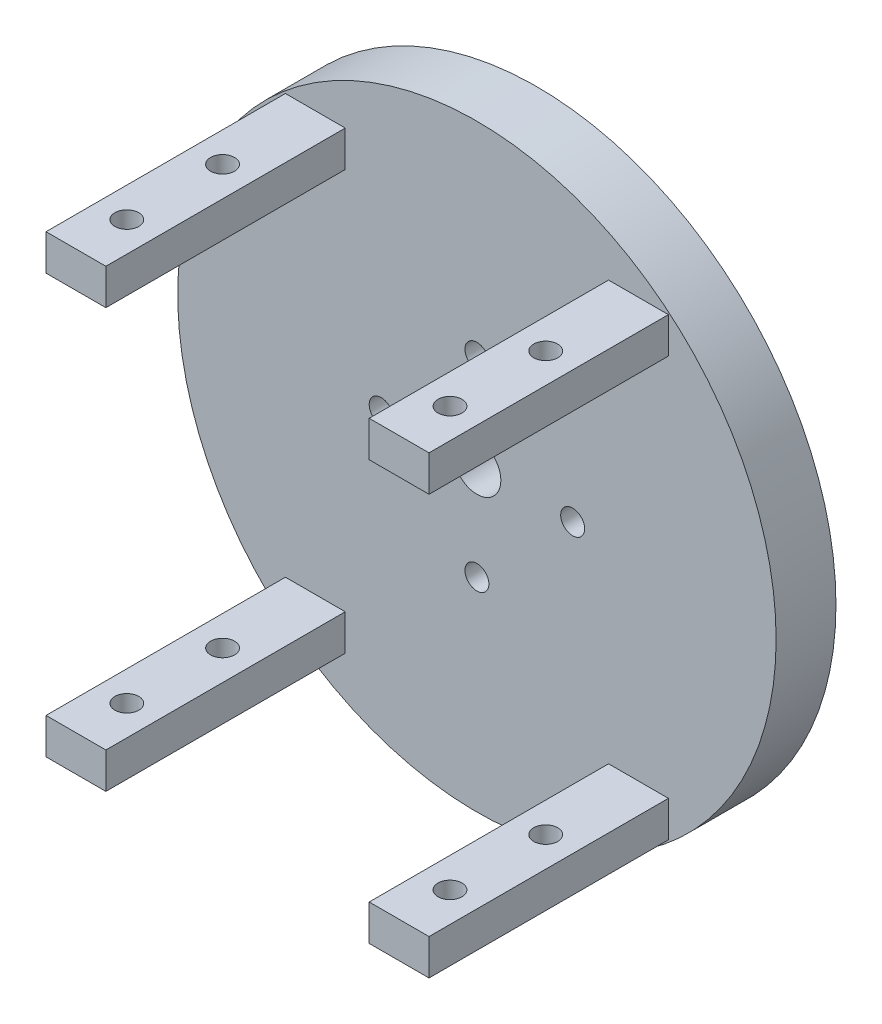
ISO-10303-21;
HEADER;
FILE_DESCRIPTION(('STEP AP214'),'2;1');
FILE_NAME('part.step','',(''),(''),'','','');
FILE_SCHEMA(('AUTOMOTIVE_DESIGN { 1 0 10303 214 1 1 1 1 }'));
ENDSEC;
DATA;
#1=APPLICATION_CONTEXT('core data for automotive mechanical design processes');
#2=APPLICATION_PROTOCOL_DEFINITION('international standard','automotive_design',2000,#1);
#3=PRODUCT_CONTEXT('',#1,'mechanical');
#4=PRODUCT('Part','Part','',(#3));
#5=PRODUCT_RELATED_PRODUCT_CATEGORY('part','',(#4));
#6=PRODUCT_DEFINITION_FORMATION('','',#4);
#7=PRODUCT_DEFINITION_CONTEXT('part definition',#1,'design');
#8=PRODUCT_DEFINITION('design','',#6,#7);
#9=PRODUCT_DEFINITION_SHAPE('','',#8);
#10=(LENGTH_UNIT() NAMED_UNIT(*) SI_UNIT(.MILLI.,.METRE.));
#11=(NAMED_UNIT(*) PLANE_ANGLE_UNIT() SI_UNIT($,.RADIAN.));
#12=(NAMED_UNIT(*) SI_UNIT($,.STERADIAN.) SOLID_ANGLE_UNIT());
#13=UNCERTAINTY_MEASURE_WITH_UNIT(LENGTH_MEASURE(1.E-05),#10,'distance_accuracy_value','');
#14=(GEOMETRIC_REPRESENTATION_CONTEXT(3) GLOBAL_UNCERTAINTY_ASSIGNED_CONTEXT((#13)) GLOBAL_UNIT_ASSIGNED_CONTEXT((#10,
#11,#12)) REPRESENTATION_CONTEXT('',''));
#15=CARTESIAN_POINT('',(0.,0.,0.));
#16=DIRECTION('',(0.,0.,1.));
#17=DIRECTION('',(1.,0.,0.));
#18=AXIS2_PLACEMENT_3D('',#15,#16,#17);
#19=CARTESIAN_POINT('',(2.25414240564596E-13,0.,5.));
#20=DIRECTION('',(0.,0.,1.));
#21=DIRECTION('',(1.,0.,0.));
#22=AXIS2_PLACEMENT_3D('',#19,#20,#21);
#23=PLANE('',#22);
#24=CARTESIAN_POINT('',(4.51808198568511E-13,-8.,5.));
#25=DIRECTION('',(0.,0.,1.));
#26=DIRECTION('',(1.,0.,0.));
#27=AXIS2_PLACEMENT_3D('',#24,#25,#26);
#28=CIRCLE('',#27,1.00000000000049);
#29=CARTESIAN_POINT('',(1.00000000000094,-8.,5.));
#30=VERTEX_POINT('',#29);
#31=EDGE_CURVE('E329',#30,#30,#28,.T.);
#32=ORIENTED_EDGE('',*,*,#31,.F.);
#33=EDGE_LOOP('',(#32));
#34=FACE_BOUND('',#33,.T.);
#35=CARTESIAN_POINT('',(0.,8.,5.));
#36=DIRECTION('',(0.,0.,1.));
#37=DIRECTION('',(1.,0.,0.));
#38=AXIS2_PLACEMENT_3D('',#35,#36,#37);
#39=CIRCLE('',#38,1.);
#40=CARTESIAN_POINT('',(1.,8.,5.));
#41=VERTEX_POINT('',#40);
#42=EDGE_CURVE('E345',#41,#41,#39,.T.);
#43=ORIENTED_EDGE('',*,*,#42,.F.);
#44=EDGE_LOOP('',(#43));
#45=FACE_BOUND('',#44,.T.);
#46=CARTESIAN_POINT('',(2.25414240564596E-13,0.,5.));
#47=DIRECTION('',(0.,0.,1.));
#48=DIRECTION('',(1.,0.,0.));
#49=AXIS2_PLACEMENT_3D('',#46,#47,#48);
#50=CIRCLE('',#49,25.);
#51=CARTESIAN_POINT('',(25.0000000000002,0.,5.));
#52=VERTEX_POINT('',#51);
#53=EDGE_CURVE('E11',#52,#52,#50,.T.);
#54=ORIENTED_EDGE('',*,*,#53,.T.);
#55=EDGE_LOOP('',(#54));
#56=FACE_BOUND('',#55,.T.);
#57=CARTESIAN_POINT('',(2.25414240564596E-13,0.,5.));
#58=DIRECTION('',(0.,0.,1.));
#59=DIRECTION('',(1.,0.,0.));
#60=AXIS2_PLACEMENT_3D('',#57,#58,#59);
#61=CIRCLE('',#60,2.);
#62=CARTESIAN_POINT('',(2.00000000000023,0.,5.));
#63=VERTEX_POINT('',#62);
#64=EDGE_CURVE('E353',#63,#63,#61,.T.);
#65=ORIENTED_EDGE('',*,*,#64,.F.);
#66=EDGE_LOOP('',(#65));
#67=FACE_BOUND('',#66,.T.);
#68=CARTESIAN_POINT('',(8.,0.,5.));
#69=DIRECTION('',(0.,0.,1.));
#70=DIRECTION('',(1.,0.,0.));
#71=AXIS2_PLACEMENT_3D('',#68,#69,#70);
#72=CIRCLE('',#71,1.);
#73=CARTESIAN_POINT('',(9.,0.,5.));
#74=VERTEX_POINT('',#73);
#75=EDGE_CURVE('E337',#74,#74,#72,.T.);
#76=ORIENTED_EDGE('',*,*,#75,.F.);
#77=EDGE_LOOP('',(#76));
#78=FACE_BOUND('',#77,.T.);
#79=CARTESIAN_POINT('',(-8.,0.,5.));
#80=DIRECTION('',(0.,0.,1.));
#81=DIRECTION('',(1.,0.,0.));
#82=AXIS2_PLACEMENT_3D('',#79,#80,#81);
#83=CIRCLE('',#82,1.);
#84=CARTESIAN_POINT('',(-7.,0.,5.));
#85=VERTEX_POINT('',#84);
#86=EDGE_CURVE('E321',#85,#85,#83,.T.);
#87=ORIENTED_EDGE('',*,*,#86,.F.);
#88=EDGE_LOOP('',(#87));
#89=FACE_BOUND('',#88,.T.);
#90=DIRECTION('',(1.,0.,0.));
#91=VECTOR('',#90,1.);
#92=CARTESIAN_POINT('',(11.0000000000002,-19.,5.));
#93=LINE('',#92,#91);
#94=CARTESIAN_POINT('',(11.0000000000002,-19.,5.));
#95=VERTEX_POINT('',#94);
#96=CARTESIAN_POINT('',(16.0000000000002,-19.,5.));
#97=VERTEX_POINT('',#96);
#98=EDGE_CURVE('E298',#95,#97,#93,.T.);
#99=ORIENTED_EDGE('',*,*,#98,.F.);
#100=DIRECTION('',(0.,-1.,0.));
#101=VECTOR('',#100,1.);
#102=CARTESIAN_POINT('',(11.0000000000002,-16.,5.));
#103=LINE('',#102,#101);
#104=CARTESIAN_POINT('',(11.0000000000002,-16.,5.));
#105=VERTEX_POINT('',#104);
#106=EDGE_CURVE('E268',#105,#95,#103,.T.);
#107=ORIENTED_EDGE('',*,*,#106,.F.);
#108=DIRECTION('',(-1.,0.,0.));
#109=VECTOR('',#108,1.);
#110=CARTESIAN_POINT('',(11.0000000000002,-16.,5.));
#111=LINE('',#110,#109);
#112=CARTESIAN_POINT('',(16.0000000000002,-16.,5.));
#113=VERTEX_POINT('',#112);
#114=EDGE_CURVE('E285',#113,#105,#111,.T.);
#115=ORIENTED_EDGE('',*,*,#114,.F.);
#116=DIRECTION('',(0.,1.,0.));
#117=VECTOR('',#116,1.);
#118=CARTESIAN_POINT('',(16.0000000000002,-19.,5.));
#119=LINE('',#118,#117);
#120=EDGE_CURVE('E301',#97,#113,#119,.T.);
#121=ORIENTED_EDGE('',*,*,#120,.F.);
#122=EDGE_LOOP('',(#99,#107,#115,#121));
#123=FACE_BOUND('',#122,.T.);
#124=DIRECTION('',(-1.,0.,0.));
#125=VECTOR('',#124,1.);
#126=CARTESIAN_POINT('',(-10.9999999999998,19.,5.));
#127=LINE('',#126,#125);
#128=CARTESIAN_POINT('',(-10.9999999999998,19.,5.));
#129=VERTEX_POINT('',#128);
#130=CARTESIAN_POINT('',(-15.9999999999998,19.,5.));
#131=VERTEX_POINT('',#130);
#132=EDGE_CURVE('E261',#129,#131,#127,.T.);
#133=ORIENTED_EDGE('',*,*,#132,.F.);
#134=DIRECTION('',(0.,1.,0.));
#135=VECTOR('',#134,1.);
#136=CARTESIAN_POINT('',(-10.9999999999998,19.,5.));
#137=LINE('',#136,#135);
#138=CARTESIAN_POINT('',(-10.9999999999998,16.,5.));
#139=VERTEX_POINT('',#138);
#140=EDGE_CURVE('E264',#139,#129,#137,.T.);
#141=ORIENTED_EDGE('',*,*,#140,.F.);
#142=DIRECTION('',(1.,0.,0.));
#143=VECTOR('',#142,1.);
#144=CARTESIAN_POINT('',(-15.9999999999998,16.,5.));
#145=LINE('',#144,#143);
#146=CARTESIAN_POINT('',(-15.9999999999998,16.,5.));
#147=VERTEX_POINT('',#146);
#148=EDGE_CURVE('E253',#147,#139,#145,.T.);
#149=ORIENTED_EDGE('',*,*,#148,.F.);
#150=DIRECTION('',(0.,-1.,0.));
#151=VECTOR('',#150,1.);
#152=CARTESIAN_POINT('',(-15.9999999999998,19.,5.));
#153=LINE('',#152,#151);
#154=EDGE_CURVE('E256',#131,#147,#153,.T.);
#155=ORIENTED_EDGE('',*,*,#154,.F.);
#156=EDGE_LOOP('',(#133,#141,#149,#155));
#157=FACE_BOUND('',#156,.T.);
#158=DIRECTION('',(-1.,0.,0.));
#159=VECTOR('',#158,1.);
#160=CARTESIAN_POINT('',(-15.9999999999998,-16.,5.));
#161=LINE('',#160,#159);
#162=CARTESIAN_POINT('',(-10.9999999999998,-16.,5.));
#163=VERTEX_POINT('',#162);
#164=CARTESIAN_POINT('',(-15.9999999999998,-16.,5.));
#165=VERTEX_POINT('',#164);
#166=EDGE_CURVE('E220',#163,#165,#161,.T.);
#167=ORIENTED_EDGE('',*,*,#166,.F.);
#168=DIRECTION('',(0.,1.,0.));
#169=VECTOR('',#168,1.);
#170=CARTESIAN_POINT('',(-10.9999999999998,-16.,5.));
#171=LINE('',#170,#169);
#172=CARTESIAN_POINT('',(-10.9999999999998,-19.,5.));
#173=VERTEX_POINT('',#172);
#174=EDGE_CURVE('E223',#173,#163,#171,.T.);
#175=ORIENTED_EDGE('',*,*,#174,.F.);
#176=DIRECTION('',(1.,0.,0.));
#177=VECTOR('',#176,1.);
#178=CARTESIAN_POINT('',(-15.9999999999998,-19.,5.));
#179=LINE('',#178,#177);
#180=CARTESIAN_POINT('',(-15.9999999999998,-19.,5.));
#181=VERTEX_POINT('',#180);
#182=EDGE_CURVE('E213',#181,#173,#179,.T.);
#183=ORIENTED_EDGE('',*,*,#182,.F.);
#184=DIRECTION('',(0.,-1.,0.));
#185=VECTOR('',#184,1.);
#186=CARTESIAN_POINT('',(-15.9999999999998,-16.,5.));
#187=LINE('',#186,#185);
#188=EDGE_CURVE('E216',#165,#181,#187,.T.);
#189=ORIENTED_EDGE('',*,*,#188,.F.);
#190=EDGE_LOOP('',(#167,#175,#183,#189));
#191=FACE_BOUND('',#190,.T.);
#192=DIRECTION('',(0.,-1.,0.));
#193=VECTOR('',#192,1.);
#194=CARTESIAN_POINT('',(11.0000000000002,19.,5.));
#195=LINE('',#194,#193);
#196=CARTESIAN_POINT('',(11.0000000000002,19.,5.));
#197=VERTEX_POINT('',#196);
#198=CARTESIAN_POINT('',(11.0000000000002,16.,5.));
#199=VERTEX_POINT('',#198);
#200=EDGE_CURVE('E182',#197,#199,#195,.T.);
#201=ORIENTED_EDGE('',*,*,#200,.F.);
#202=DIRECTION('',(-1.,0.,0.));
#203=VECTOR('',#202,1.);
#204=CARTESIAN_POINT('',(16.0000000000002,19.,5.));
#205=LINE('',#204,#203);
#206=CARTESIAN_POINT('',(16.0000000000002,19.,5.));
#207=VERTEX_POINT('',#206);
#208=EDGE_CURVE('E176',#207,#197,#205,.T.);
#209=ORIENTED_EDGE('',*,*,#208,.F.);
#210=DIRECTION('',(0.,1.,0.));
#211=VECTOR('',#210,1.);
#212=CARTESIAN_POINT('',(16.0000000000002,16.,5.));
#213=LINE('',#212,#211);
#214=CARTESIAN_POINT('',(16.0000000000002,16.,5.));
#215=VERTEX_POINT('',#214);
#216=EDGE_CURVE('E160',#215,#207,#213,.T.);
#217=ORIENTED_EDGE('',*,*,#216,.F.);
#218=DIRECTION('',(1.,0.,0.));
#219=VECTOR('',#218,1.);
#220=CARTESIAN_POINT('',(11.0000000000002,16.,5.));
#221=LINE('',#220,#219);
#222=EDGE_CURVE('E169',#199,#215,#221,.T.);
#223=ORIENTED_EDGE('',*,*,#222,.F.);
#224=EDGE_LOOP('',(#201,#209,#217,#223));
#225=FACE_BOUND('',#224,.T.);
#226=ADVANCED_FACE('F43',(#34,#45,#56,#67,#78,#89,#123,#157,#191,#225),#23,.T.);
#227=CARTESIAN_POINT('',(2.25414240564596E-13,0.,0.));
#228=DIRECTION('',(0.,0.,1.));
#229=DIRECTION('',(1.,0.,0.));
#230=AXIS2_PLACEMENT_3D('',#227,#228,#229);
#231=PLANE('',#230);
#232=CARTESIAN_POINT('',(2.25414240564596E-13,0.,0.));
#233=DIRECTION('',(0.,0.,1.));
#234=DIRECTION('',(1.,0.,0.));
#235=AXIS2_PLACEMENT_3D('',#232,#233,#234);
#236=CIRCLE('',#235,25.);
#237=CARTESIAN_POINT('',(25.0000000000002,0.,0.));
#238=VERTEX_POINT('',#237);
#239=EDGE_CURVE('E53',#238,#238,#236,.T.);
#240=ORIENTED_EDGE('',*,*,#239,.F.);
#241=EDGE_LOOP('',(#240));
#242=FACE_BOUND('',#241,.T.);
#243=CARTESIAN_POINT('',(2.25414240564596E-13,0.,0.));
#244=DIRECTION('',(0.,0.,1.));
#245=DIRECTION('',(1.,0.,0.));
#246=AXIS2_PLACEMENT_3D('',#243,#244,#245);
#247=CIRCLE('',#246,2.);
#248=CARTESIAN_POINT('',(2.00000000000023,0.,0.));
#249=VERTEX_POINT('',#248);
#250=EDGE_CURVE('E349',#249,#249,#247,.T.);
#251=ORIENTED_EDGE('',*,*,#250,.T.);
#252=EDGE_LOOP('',(#251));
#253=FACE_BOUND('',#252,.T.);
#254=CARTESIAN_POINT('',(0.,8.,0.));
#255=DIRECTION('',(0.,0.,1.));
#256=DIRECTION('',(1.,0.,0.));
#257=AXIS2_PLACEMENT_3D('',#254,#255,#256);
#258=CIRCLE('',#257,1.);
#259=CARTESIAN_POINT('',(1.,8.,0.));
#260=VERTEX_POINT('',#259);
#261=EDGE_CURVE('E341',#260,#260,#258,.T.);
#262=ORIENTED_EDGE('',*,*,#261,.T.);
#263=EDGE_LOOP('',(#262));
#264=FACE_BOUND('',#263,.T.);
#265=CARTESIAN_POINT('',(8.,0.,0.));
#266=DIRECTION('',(0.,0.,1.));
#267=DIRECTION('',(1.,0.,0.));
#268=AXIS2_PLACEMENT_3D('',#265,#266,#267);
#269=CIRCLE('',#268,1.);
#270=CARTESIAN_POINT('',(9.,0.,0.));
#271=VERTEX_POINT('',#270);
#272=EDGE_CURVE('E333',#271,#271,#269,.T.);
#273=ORIENTED_EDGE('',*,*,#272,.T.);
#274=EDGE_LOOP('',(#273));
#275=FACE_BOUND('',#274,.T.);
#276=CARTESIAN_POINT('',(4.51808198568511E-13,-8.,0.));
#277=DIRECTION('',(0.,0.,1.));
#278=DIRECTION('',(1.,0.,0.));
#279=AXIS2_PLACEMENT_3D('',#276,#277,#278);
#280=CIRCLE('',#279,1.00000000000049);
#281=CARTESIAN_POINT('',(1.00000000000094,-8.,0.));
#282=VERTEX_POINT('',#281);
#283=EDGE_CURVE('E325',#282,#282,#280,.T.);
#284=ORIENTED_EDGE('',*,*,#283,.T.);
#285=EDGE_LOOP('',(#284));
#286=FACE_BOUND('',#285,.T.);
#287=CARTESIAN_POINT('',(-8.,0.,0.));
#288=DIRECTION('',(0.,0.,1.));
#289=DIRECTION('',(1.,0.,0.));
#290=AXIS2_PLACEMENT_3D('',#287,#288,#289);
#291=CIRCLE('',#290,1.);
#292=CARTESIAN_POINT('',(-7.,0.,0.));
#293=VERTEX_POINT('',#292);
#294=EDGE_CURVE('E320',#293,#293,#291,.T.);
#295=ORIENTED_EDGE('',*,*,#294,.T.);
#296=EDGE_LOOP('',(#295));
#297=FACE_BOUND('',#296,.T.);
#298=ADVANCED_FACE('F451',(#242,#253,#264,#275,#286,#297),#231,.F.);
#299=CARTESIAN_POINT('',(2.25414240564596E-13,0.,5.));
#300=DIRECTION('',(0.,0.,-1.));
#301=DIRECTION('',(-1.,0.,0.));
#302=AXIS2_PLACEMENT_3D('',#299,#300,#301);
#303=CYLINDRICAL_SURFACE('',#302,25.);
#304=ORIENTED_EDGE('',*,*,#53,.F.);
#305=EDGE_LOOP('',(#304));
#306=FACE_BOUND('',#305,.T.);
#307=ORIENTED_EDGE('',*,*,#239,.T.);
#308=EDGE_LOOP('',(#307));
#309=FACE_BOUND('',#308,.T.);
#310=ADVANCED_FACE('F45',(#306,#309),#303,.T.);
#311=CARTESIAN_POINT('',(2.25414240564596E-13,0.,5.));
#312=DIRECTION('',(0.,0.,-1.));
#313=DIRECTION('',(-1.,0.,0.));
#314=AXIS2_PLACEMENT_3D('',#311,#312,#313);
#315=CYLINDRICAL_SURFACE('',#314,2.);
#316=ORIENTED_EDGE('',*,*,#64,.T.);
#317=EDGE_LOOP('',(#316));
#318=FACE_BOUND('',#317,.T.);
#319=ORIENTED_EDGE('',*,*,#250,.F.);
#320=EDGE_LOOP('',(#319));
#321=FACE_BOUND('',#320,.T.);
#322=ADVANCED_FACE('F463',(#318,#321),#315,.F.);
#323=CARTESIAN_POINT('',(0.,8.,5.));
#324=DIRECTION('',(0.,0.,-1.));
#325=DIRECTION('',(-1.,0.,0.));
#326=AXIS2_PLACEMENT_3D('',#323,#324,#325);
#327=CYLINDRICAL_SURFACE('',#326,1.);
#328=ORIENTED_EDGE('',*,*,#42,.T.);
#329=EDGE_LOOP('',(#328));
#330=FACE_BOUND('',#329,.T.);
#331=ORIENTED_EDGE('',*,*,#261,.F.);
#332=EDGE_LOOP('',(#331));
#333=FACE_BOUND('',#332,.T.);
#334=ADVANCED_FACE('F466',(#330,#333),#327,.F.);
#335=CARTESIAN_POINT('',(8.,0.,5.));
#336=DIRECTION('',(0.,0.,-1.));
#337=DIRECTION('',(-1.,0.,0.));
#338=AXIS2_PLACEMENT_3D('',#335,#336,#337);
#339=CYLINDRICAL_SURFACE('',#338,1.);
#340=ORIENTED_EDGE('',*,*,#75,.T.);
#341=EDGE_LOOP('',(#340));
#342=FACE_BOUND('',#341,.T.);
#343=ORIENTED_EDGE('',*,*,#272,.F.);
#344=EDGE_LOOP('',(#343));
#345=FACE_BOUND('',#344,.T.);
#346=ADVANCED_FACE('F470',(#342,#345),#339,.F.);
#347=CARTESIAN_POINT('',(4.51808198568511E-13,-8.,5.));
#348=DIRECTION('',(0.,0.,-1.));
#349=DIRECTION('',(-1.,0.,0.));
#350=AXIS2_PLACEMENT_3D('',#347,#348,#349);
#351=CYLINDRICAL_SURFACE('',#350,1.00000000000049);
#352=ORIENTED_EDGE('',*,*,#31,.T.);
#353=EDGE_LOOP('',(#352));
#354=FACE_BOUND('',#353,.T.);
#355=ORIENTED_EDGE('',*,*,#283,.F.);
#356=EDGE_LOOP('',(#355));
#357=FACE_BOUND('',#356,.T.);
#358=ADVANCED_FACE('F474',(#354,#357),#351,.F.);
#359=CARTESIAN_POINT('',(-8.,0.,5.));
#360=DIRECTION('',(0.,0.,-1.));
#361=DIRECTION('',(-1.,0.,0.));
#362=AXIS2_PLACEMENT_3D('',#359,#360,#361);
#363=CYLINDRICAL_SURFACE('',#362,1.);
#364=ORIENTED_EDGE('',*,*,#86,.T.);
#365=EDGE_LOOP('',(#364));
#366=FACE_BOUND('',#365,.T.);
#367=ORIENTED_EDGE('',*,*,#294,.F.);
#368=EDGE_LOOP('',(#367));
#369=FACE_BOUND('',#368,.T.);
#370=ADVANCED_FACE('F478',(#366,#369),#363,.F.);
#371=CARTESIAN_POINT('',(11.0000000000002,-16.,25.));
#372=DIRECTION('',(1.,0.,0.));
#373=DIRECTION('',(0.,1.,0.));
#374=AXIS2_PLACEMENT_3D('',#371,#372,#373);
#375=PLANE('',#374);
#376=ORIENTED_EDGE('',*,*,#106,.T.);
#377=DIRECTION('',(0.,0.,-1.));
#378=VECTOR('',#377,1.);
#379=CARTESIAN_POINT('',(11.0000000000002,-19.,25.));
#380=LINE('',#379,#378);
#381=CARTESIAN_POINT('',(11.0000000000002,-19.,25.));
#382=VERTEX_POINT('',#381);
#383=EDGE_CURVE('E317',#382,#95,#380,.T.);
#384=ORIENTED_EDGE('',*,*,#383,.F.);
#385=DIRECTION('',(0.,-1.,0.));
#386=VECTOR('',#385,1.);
#387=CARTESIAN_POINT('',(11.0000000000002,-16.,25.));
#388=LINE('',#387,#386);
#389=CARTESIAN_POINT('',(11.0000000000002,-16.,25.));
#390=VERTEX_POINT('',#389);
#391=EDGE_CURVE('E280',#390,#382,#388,.T.);
#392=ORIENTED_EDGE('',*,*,#391,.F.);
#393=DIRECTION('',(0.,0.,-1.));
#394=VECTOR('',#393,1.);
#395=CARTESIAN_POINT('',(11.0000000000002,-16.,25.));
#396=LINE('',#395,#394);
#397=EDGE_CURVE('E294',#390,#105,#396,.T.);
#398=ORIENTED_EDGE('',*,*,#397,.T.);
#399=EDGE_LOOP('',(#376,#384,#392,#398));
#400=FACE_BOUND('',#399,.T.);
#401=ADVANCED_FACE('F482',(#400),#375,.F.);
#402=CARTESIAN_POINT('',(11.0000000000002,-19.,25.));
#403=DIRECTION('',(0.,1.,0.));
#404=DIRECTION('',(-1.,0.,0.));
#405=AXIS2_PLACEMENT_3D('',#402,#403,#404);
#406=PLANE('',#405);
#407=CARTESIAN_POINT('',(13.5,-19.,20.75));
#408=DIRECTION('',(0.,-1.,0.));
#409=DIRECTION('',(0.,0.,-1.));
#410=AXIS2_PLACEMENT_3D('',#407,#408,#409);
#411=CIRCLE('',#410,1.);
#412=CARTESIAN_POINT('',(13.5,-19.,19.75));
#413=VERTEX_POINT('',#412);
#414=EDGE_CURVE('E381',#413,#413,#411,.T.);
#415=ORIENTED_EDGE('',*,*,#414,.F.);
#416=EDGE_LOOP('',(#415));
#417=FACE_BOUND('',#416,.T.);
#418=CARTESIAN_POINT('',(13.5,-19.,12.75));
#419=DIRECTION('',(0.,-1.,0.));
#420=DIRECTION('',(0.,0.,-1.));
#421=AXIS2_PLACEMENT_3D('',#418,#419,#420);
#422=CIRCLE('',#421,0.999999999999999);
#423=CARTESIAN_POINT('',(13.5,-19.,11.75));
#424=VERTEX_POINT('',#423);
#425=EDGE_CURVE('E809',#424,#424,#422,.T.);
#426=ORIENTED_EDGE('',*,*,#425,.F.);
#427=EDGE_LOOP('',(#426));
#428=FACE_BOUND('',#427,.T.);
#429=ORIENTED_EDGE('',*,*,#98,.T.);
#430=DIRECTION('',(0.,0.,-1.));
#431=VECTOR('',#430,1.);
#432=CARTESIAN_POINT('',(16.0000000000002,-19.,25.));
#433=LINE('',#432,#431);
#434=CARTESIAN_POINT('',(16.0000000000002,-19.,25.));
#435=VERTEX_POINT('',#434);
#436=EDGE_CURVE('E313',#435,#97,#433,.T.);
#437=ORIENTED_EDGE('',*,*,#436,.F.);
#438=DIRECTION('',(1.,0.,0.));
#439=VECTOR('',#438,1.);
#440=CARTESIAN_POINT('',(11.0000000000002,-19.,25.));
#441=LINE('',#440,#439);
#442=EDGE_CURVE('E284',#382,#435,#441,.T.);
#443=ORIENTED_EDGE('',*,*,#442,.F.);
#444=ORIENTED_EDGE('',*,*,#383,.T.);
#445=EDGE_LOOP('',(#429,#437,#443,#444));
#446=FACE_BOUND('',#445,.T.);
#447=ADVANCED_FACE('F486',(#417,#428,#446),#406,.F.);
#448=CARTESIAN_POINT('',(16.0000000000002,-19.,25.));
#449=DIRECTION('',(-1.,0.,0.));
#450=DIRECTION('',(0.,0.,1.));
#451=AXIS2_PLACEMENT_3D('',#448,#449,#450);
#452=PLANE('',#451);
#453=ORIENTED_EDGE('',*,*,#120,.T.);
#454=DIRECTION('',(0.,0.,-1.));
#455=VECTOR('',#454,1.);
#456=CARTESIAN_POINT('',(16.0000000000002,-16.,25.));
#457=LINE('',#456,#455);
#458=CARTESIAN_POINT('',(16.0000000000002,-16.,25.));
#459=VERTEX_POINT('',#458);
#460=EDGE_CURVE('E310',#459,#113,#457,.T.);
#461=ORIENTED_EDGE('',*,*,#460,.F.);
#462=DIRECTION('',(0.,1.,0.));
#463=VECTOR('',#462,1.);
#464=CARTESIAN_POINT('',(16.0000000000002,-19.,25.));
#465=LINE('',#464,#463);
#466=EDGE_CURVE('E288',#435,#459,#465,.T.);
#467=ORIENTED_EDGE('',*,*,#466,.F.);
#468=ORIENTED_EDGE('',*,*,#436,.T.);
#469=EDGE_LOOP('',(#453,#461,#467,#468));
#470=FACE_BOUND('',#469,.T.);
#471=ADVANCED_FACE('F490',(#470),#452,.F.);
#472=CARTESIAN_POINT('',(11.0000000000002,-16.,25.));
#473=DIRECTION('',(0.,-1.,0.));
#474=DIRECTION('',(1.,0.,0.));
#475=AXIS2_PLACEMENT_3D('',#472,#473,#474);
#476=PLANE('',#475);
#477=CARTESIAN_POINT('',(13.5,-16.,20.75));
#478=DIRECTION('',(0.,-1.,0.));
#479=DIRECTION('',(1.,0.,0.));
#480=AXIS2_PLACEMENT_3D('',#477,#478,#479);
#481=CIRCLE('',#480,1.);
#482=CARTESIAN_POINT('',(14.5,-16.,20.75));
#483=VERTEX_POINT('',#482);
#484=EDGE_CURVE('E392',#483,#483,#481,.T.);
#485=ORIENTED_EDGE('',*,*,#484,.T.);
#486=EDGE_LOOP('',(#485));
#487=FACE_BOUND('',#486,.T.);
#488=CARTESIAN_POINT('',(13.5,-16.,12.75));
#489=DIRECTION('',(0.,-1.,0.));
#490=DIRECTION('',(1.,0.,0.));
#491=AXIS2_PLACEMENT_3D('',#488,#489,#490);
#492=CIRCLE('',#491,0.999999999999999);
#493=CARTESIAN_POINT('',(14.5,-16.,12.75));
#494=VERTEX_POINT('',#493);
#495=EDGE_CURVE('E372',#494,#494,#492,.T.);
#496=ORIENTED_EDGE('',*,*,#495,.T.);
#497=EDGE_LOOP('',(#496));
#498=FACE_BOUND('',#497,.T.);
#499=ORIENTED_EDGE('',*,*,#114,.T.);
#500=ORIENTED_EDGE('',*,*,#397,.F.);
#501=DIRECTION('',(-1.,0.,0.));
#502=VECTOR('',#501,1.);
#503=CARTESIAN_POINT('',(11.0000000000002,-16.,25.));
#504=LINE('',#503,#502);
#505=EDGE_CURVE('E291',#459,#390,#504,.T.);
#506=ORIENTED_EDGE('',*,*,#505,.F.);
#507=ORIENTED_EDGE('',*,*,#460,.T.);
#508=EDGE_LOOP('',(#499,#500,#506,#507));
#509=FACE_BOUND('',#508,.T.);
#510=ADVANCED_FACE('F494',(#487,#498,#509),#476,.F.);
#511=CARTESIAN_POINT('',(0.,0.,25.));
#512=DIRECTION('',(0.,0.,1.));
#513=DIRECTION('',(1.,0.,0.));
#514=AXIS2_PLACEMENT_3D('',#511,#512,#513);
#515=PLANE('',#514);
#516=ORIENTED_EDGE('',*,*,#391,.T.);
#517=ORIENTED_EDGE('',*,*,#442,.T.);
#518=ORIENTED_EDGE('',*,*,#466,.T.);
#519=ORIENTED_EDGE('',*,*,#505,.T.);
#520=EDGE_LOOP('',(#516,#517,#518,#519));
#521=FACE_BOUND('',#520,.T.);
#522=ADVANCED_FACE('F498',(#521),#515,.T.);
#523=CARTESIAN_POINT('',(-10.9999999999998,19.,25.));
#524=DIRECTION('',(-1.,0.,0.));
#525=DIRECTION('',(0.,-1.,0.));
#526=AXIS2_PLACEMENT_3D('',#523,#524,#525);
#527=PLANE('',#526);
#528=ORIENTED_EDGE('',*,*,#140,.T.);
#529=DIRECTION('',(0.,0.,-1.));
#530=VECTOR('',#529,1.);
#531=CARTESIAN_POINT('',(-10.9999999999998,19.,25.));
#532=LINE('',#531,#530);
#533=CARTESIAN_POINT('',(-10.9999999999998,19.,25.));
#534=VERTEX_POINT('',#533);
#535=EDGE_CURVE('E227',#534,#129,#532,.T.);
#536=ORIENTED_EDGE('',*,*,#535,.F.);
#537=DIRECTION('',(0.,1.,0.));
#538=VECTOR('',#537,1.);
#539=CARTESIAN_POINT('',(-10.9999999999998,19.,25.));
#540=LINE('',#539,#538);
#541=CARTESIAN_POINT('',(-10.9999999999998,16.,25.));
#542=VERTEX_POINT('',#541);
#543=EDGE_CURVE('E257',#542,#534,#540,.T.);
#544=ORIENTED_EDGE('',*,*,#543,.F.);
#545=DIRECTION('',(0.,0.,-1.));
#546=VECTOR('',#545,1.);
#547=CARTESIAN_POINT('',(-10.9999999999998,16.,25.));
#548=LINE('',#547,#546);
#549=EDGE_CURVE('E248',#542,#139,#548,.T.);
#550=ORIENTED_EDGE('',*,*,#549,.T.);
#551=EDGE_LOOP('',(#528,#536,#544,#550));
#552=FACE_BOUND('',#551,.T.);
#553=ADVANCED_FACE('F502',(#552),#527,.F.);
#554=CARTESIAN_POINT('',(-10.9999999999998,19.,25.));
#555=DIRECTION('',(0.,-1.,0.));
#556=DIRECTION('',(0.,0.,-1.));
#557=AXIS2_PLACEMENT_3D('',#554,#555,#556);
#558=PLANE('',#557);
#559=CARTESIAN_POINT('',(-13.5,19.,12.75));
#560=DIRECTION('',(0.,-1.,0.));
#561=DIRECTION('',(0.,0.,-1.));
#562=AXIS2_PLACEMENT_3D('',#559,#560,#561);
#563=CIRCLE('',#562,1.);
#564=CARTESIAN_POINT('',(-13.5,19.,11.75));
#565=VERTEX_POINT('',#564);
#566=EDGE_CURVE('E416',#565,#565,#563,.T.);
#567=ORIENTED_EDGE('',*,*,#566,.T.);
#568=EDGE_LOOP('',(#567));
#569=FACE_BOUND('',#568,.T.);
#570=CARTESIAN_POINT('',(-13.5,19.,20.75));
#571=DIRECTION('',(0.,-1.,0.));
#572=DIRECTION('',(0.,0.,-1.));
#573=AXIS2_PLACEMENT_3D('',#570,#571,#572);
#574=CIRCLE('',#573,1.);
#575=CARTESIAN_POINT('',(-13.5,19.,19.75));
#576=VERTEX_POINT('',#575);
#577=EDGE_CURVE('E404',#576,#576,#574,.T.);
#578=ORIENTED_EDGE('',*,*,#577,.T.);
#579=EDGE_LOOP('',(#578));
#580=FACE_BOUND('',#579,.T.);
#581=ORIENTED_EDGE('',*,*,#132,.T.);
#582=DIRECTION('',(0.,0.,-1.));
#583=VECTOR('',#582,1.);
#584=CARTESIAN_POINT('',(-15.9999999999998,19.,25.));
#585=LINE('',#584,#583);
#586=CARTESIAN_POINT('',(-15.9999999999998,19.,25.));
#587=VERTEX_POINT('',#586);
#588=EDGE_CURVE('E241',#587,#131,#585,.T.);
#589=ORIENTED_EDGE('',*,*,#588,.F.);
#590=DIRECTION('',(-1.,0.,0.));
#591=VECTOR('',#590,1.);
#592=CARTESIAN_POINT('',(-10.9999999999998,19.,25.));
#593=LINE('',#592,#591);
#594=EDGE_CURVE('E274',#534,#587,#593,.T.);
#595=ORIENTED_EDGE('',*,*,#594,.F.);
#596=ORIENTED_EDGE('',*,*,#535,.T.);
#597=EDGE_LOOP('',(#581,#589,#595,#596));
#598=FACE_BOUND('',#597,.T.);
#599=ADVANCED_FACE('F516',(#569,#580,#598),#558,.F.);
#600=CARTESIAN_POINT('',(-15.9999999999998,19.,25.));
#601=DIRECTION('',(1.,0.,0.));
#602=DIRECTION('',(0.,0.,-1.));
#603=AXIS2_PLACEMENT_3D('',#600,#601,#602);
#604=PLANE('',#603);
#605=ORIENTED_EDGE('',*,*,#154,.T.);
#606=DIRECTION('',(0.,0.,-1.));
#607=VECTOR('',#606,1.);
#608=CARTESIAN_POINT('',(-15.9999999999998,16.,25.));
#609=LINE('',#608,#607);
#610=CARTESIAN_POINT('',(-15.9999999999998,16.,25.));
#611=VERTEX_POINT('',#610);
#612=EDGE_CURVE('E245',#611,#147,#609,.T.);
#613=ORIENTED_EDGE('',*,*,#612,.F.);
#614=DIRECTION('',(0.,-1.,0.));
#615=VECTOR('',#614,1.);
#616=CARTESIAN_POINT('',(-15.9999999999998,19.,25.));
#617=LINE('',#616,#615);
#618=EDGE_CURVE('E271',#587,#611,#617,.T.);
#619=ORIENTED_EDGE('',*,*,#618,.F.);
#620=ORIENTED_EDGE('',*,*,#588,.T.);
#621=EDGE_LOOP('',(#605,#613,#619,#620));
#622=FACE_BOUND('',#621,.T.);
#623=ADVANCED_FACE('F512',(#622),#604,.F.);
#624=CARTESIAN_POINT('',(-15.9999999999998,16.,25.));
#625=DIRECTION('',(0.,1.,0.));
#626=DIRECTION('',(-1.,0.,0.));
#627=AXIS2_PLACEMENT_3D('',#624,#625,#626);
#628=PLANE('',#627);
#629=CARTESIAN_POINT('',(-13.5,16.,12.75));
#630=DIRECTION('',(0.,1.,0.));
#631=DIRECTION('',(-1.,0.,0.));
#632=AXIS2_PLACEMENT_3D('',#629,#630,#631);
#633=CIRCLE('',#632,1.);
#634=CARTESIAN_POINT('',(-14.5,16.,12.75));
#635=VERTEX_POINT('',#634);
#636=EDGE_CURVE('E412',#635,#635,#633,.T.);
#637=ORIENTED_EDGE('',*,*,#636,.T.);
#638=EDGE_LOOP('',(#637));
#639=FACE_BOUND('',#638,.T.);
#640=CARTESIAN_POINT('',(-13.5,16.,20.75));
#641=DIRECTION('',(0.,1.,0.));
#642=DIRECTION('',(-1.,0.,0.));
#643=AXIS2_PLACEMENT_3D('',#640,#641,#642);
#644=CIRCLE('',#643,1.);
#645=CARTESIAN_POINT('',(-14.5,16.,20.75));
#646=VERTEX_POINT('',#645);
#647=EDGE_CURVE('E400',#646,#646,#644,.T.);
#648=ORIENTED_EDGE('',*,*,#647,.T.);
#649=EDGE_LOOP('',(#648));
#650=FACE_BOUND('',#649,.T.);
#651=ORIENTED_EDGE('',*,*,#148,.T.);
#652=ORIENTED_EDGE('',*,*,#549,.F.);
#653=DIRECTION('',(1.,0.,0.));
#654=VECTOR('',#653,1.);
#655=CARTESIAN_POINT('',(-15.9999999999998,16.,25.));
#656=LINE('',#655,#654);
#657=EDGE_CURVE('E252',#611,#542,#656,.T.);
#658=ORIENTED_EDGE('',*,*,#657,.F.);
#659=ORIENTED_EDGE('',*,*,#612,.T.);
#660=EDGE_LOOP('',(#651,#652,#658,#659));
#661=FACE_BOUND('',#660,.T.);
#662=ADVANCED_FACE('F508',(#639,#650,#661),#628,.F.);
#663=CARTESIAN_POINT('',(0.,0.,25.));
#664=DIRECTION('',(0.,0.,1.));
#665=DIRECTION('',(1.,0.,0.));
#666=AXIS2_PLACEMENT_3D('',#663,#664,#665);
#667=PLANE('',#666);
#668=ORIENTED_EDGE('',*,*,#543,.T.);
#669=ORIENTED_EDGE('',*,*,#594,.T.);
#670=ORIENTED_EDGE('',*,*,#618,.T.);
#671=ORIENTED_EDGE('',*,*,#657,.T.);
#672=EDGE_LOOP('',(#668,#669,#670,#671));
#673=FACE_BOUND('',#672,.T.);
#674=ADVANCED_FACE('F504',(#673),#667,.T.);
#675=CARTESIAN_POINT('',(-10.9999999999998,-16.,25.));
#676=DIRECTION('',(-1.,0.,0.));
#677=DIRECTION('',(0.,-1.,0.));
#678=AXIS2_PLACEMENT_3D('',#675,#676,#677);
#679=PLANE('',#678);
#680=ORIENTED_EDGE('',*,*,#174,.T.);
#681=DIRECTION('',(0.,0.,-1.));
#682=VECTOR('',#681,1.);
#683=CARTESIAN_POINT('',(-10.9999999999998,-16.,25.));
#684=LINE('',#683,#682);
#685=CARTESIAN_POINT('',(-10.9999999999998,-16.,25.));
#686=VERTEX_POINT('',#685);
#687=EDGE_CURVE('E184',#686,#163,#684,.T.);
#688=ORIENTED_EDGE('',*,*,#687,.F.);
#689=DIRECTION('',(0.,1.,0.));
#690=VECTOR('',#689,1.);
#691=CARTESIAN_POINT('',(-10.9999999999998,-16.,25.));
#692=LINE('',#691,#690);
#693=CARTESIAN_POINT('',(-10.9999999999998,-19.,25.));
#694=VERTEX_POINT('',#693);
#695=EDGE_CURVE('E217',#694,#686,#692,.T.);
#696=ORIENTED_EDGE('',*,*,#695,.F.);
#697=DIRECTION('',(0.,0.,-1.));
#698=VECTOR('',#697,1.);
#699=CARTESIAN_POINT('',(-10.9999999999998,-19.,25.));
#700=LINE('',#699,#698);
#701=EDGE_CURVE('E208',#694,#173,#700,.T.);
#702=ORIENTED_EDGE('',*,*,#701,.T.);
#703=EDGE_LOOP('',(#680,#688,#696,#702));
#704=FACE_BOUND('',#703,.T.);
#705=ADVANCED_FACE('F507',(#704),#679,.F.);
#706=CARTESIAN_POINT('',(-15.9999999999998,-16.,25.));
#707=DIRECTION('',(0.,-1.,0.));
#708=DIRECTION('',(1.,0.,0.));
#709=AXIS2_PLACEMENT_3D('',#706,#707,#708);
#710=PLANE('',#709);
#711=CARTESIAN_POINT('',(-13.5,-16.,12.75));
#712=DIRECTION('',(0.,-1.,0.));
#713=DIRECTION('',(1.,0.,0.));
#714=AXIS2_PLACEMENT_3D('',#711,#712,#713);
#715=CIRCLE('',#714,1.);
#716=CARTESIAN_POINT('',(-12.5,-16.,12.75));
#717=VERTEX_POINT('',#716);
#718=EDGE_CURVE('E408',#717,#717,#715,.T.);
#719=ORIENTED_EDGE('',*,*,#718,.T.);
#720=EDGE_LOOP('',(#719));
#721=FACE_BOUND('',#720,.T.);
#722=CARTESIAN_POINT('',(-13.5,-16.,20.75));
#723=DIRECTION('',(0.,-1.,0.));
#724=DIRECTION('',(1.,0.,0.));
#725=AXIS2_PLACEMENT_3D('',#722,#723,#724);
#726=CIRCLE('',#725,1.);
#727=CARTESIAN_POINT('',(-12.5,-16.,20.75));
#728=VERTEX_POINT('',#727);
#729=EDGE_CURVE('E396',#728,#728,#726,.T.);
#730=ORIENTED_EDGE('',*,*,#729,.T.);
#731=EDGE_LOOP('',(#730));
#732=FACE_BOUND('',#731,.T.);
#733=ORIENTED_EDGE('',*,*,#166,.T.);
#734=DIRECTION('',(0.,0.,-1.));
#735=VECTOR('',#734,1.);
#736=CARTESIAN_POINT('',(-15.9999999999998,-16.,25.));
#737=LINE('',#736,#735);
#738=CARTESIAN_POINT('',(-15.9999999999998,-16.,25.));
#739=VERTEX_POINT('',#738);
#740=EDGE_CURVE('E188',#739,#165,#737,.T.);
#741=ORIENTED_EDGE('',*,*,#740,.F.);
#742=DIRECTION('',(-1.,0.,0.));
#743=VECTOR('',#742,1.);
#744=CARTESIAN_POINT('',(-15.9999999999998,-16.,25.));
#745=LINE('',#744,#743);
#746=EDGE_CURVE('E233',#686,#739,#745,.T.);
#747=ORIENTED_EDGE('',*,*,#746,.F.);
#748=ORIENTED_EDGE('',*,*,#687,.T.);
#749=EDGE_LOOP('',(#733,#741,#747,#748));
#750=FACE_BOUND('',#749,.T.);
#751=ADVANCED_FACE('F535',(#721,#732,#750),#710,.F.);
#752=CARTESIAN_POINT('',(-15.9999999999998,-16.,25.));
#753=DIRECTION('',(1.,0.,0.));
#754=DIRECTION('',(0.,0.,-1.));
#755=AXIS2_PLACEMENT_3D('',#752,#753,#754);
#756=PLANE('',#755);
#757=ORIENTED_EDGE('',*,*,#188,.T.);
#758=DIRECTION('',(0.,0.,-1.));
#759=VECTOR('',#758,1.);
#760=CARTESIAN_POINT('',(-15.9999999999998,-19.,25.));
#761=LINE('',#760,#759);
#762=CARTESIAN_POINT('',(-15.9999999999998,-19.,25.));
#763=VERTEX_POINT('',#762);
#764=EDGE_CURVE('E69',#763,#181,#761,.T.);
#765=ORIENTED_EDGE('',*,*,#764,.F.);
#766=DIRECTION('',(0.,-1.,0.));
#767=VECTOR('',#766,1.);
#768=CARTESIAN_POINT('',(-15.9999999999998,-16.,25.));
#769=LINE('',#768,#767);
#770=EDGE_CURVE('E230',#739,#763,#769,.T.);
#771=ORIENTED_EDGE('',*,*,#770,.F.);
#772=ORIENTED_EDGE('',*,*,#740,.T.);
#773=EDGE_LOOP('',(#757,#765,#771,#772));
#774=FACE_BOUND('',#773,.T.);
#775=ADVANCED_FACE('F531',(#774),#756,.F.);
#776=CARTESIAN_POINT('',(-15.9999999999998,-19.,25.));
#777=DIRECTION('',(0.,1.,0.));
#778=DIRECTION('',(-1.,0.,0.));
#779=AXIS2_PLACEMENT_3D('',#776,#777,#778);
#780=PLANE('',#779);
#781=CARTESIAN_POINT('',(-13.5,-19.,12.75));
#782=DIRECTION('',(0.,-1.,0.));
#783=DIRECTION('',(0.,0.,-1.));
#784=AXIS2_PLACEMENT_3D('',#781,#782,#783);
#785=CIRCLE('',#784,1.);
#786=CARTESIAN_POINT('',(-13.5,-19.,11.75));
#787=VERTEX_POINT('',#786);
#788=EDGE_CURVE('E375',#787,#787,#785,.T.);
#789=ORIENTED_EDGE('',*,*,#788,.F.);
#790=EDGE_LOOP('',(#789));
#791=FACE_BOUND('',#790,.T.);
#792=CARTESIAN_POINT('',(-13.5,-19.,20.75));
#793=DIRECTION('',(0.,-1.,0.));
#794=DIRECTION('',(0.,0.,-1.));
#795=AXIS2_PLACEMENT_3D('',#792,#793,#794);
#796=CIRCLE('',#795,1.);
#797=CARTESIAN_POINT('',(-13.5,-19.,19.75));
#798=VERTEX_POINT('',#797);
#799=EDGE_CURVE('E366',#798,#798,#796,.T.);
#800=ORIENTED_EDGE('',*,*,#799,.F.);
#801=EDGE_LOOP('',(#800));
#802=FACE_BOUND('',#801,.T.);
#803=ORIENTED_EDGE('',*,*,#182,.T.);
#804=ORIENTED_EDGE('',*,*,#701,.F.);
#805=DIRECTION('',(1.,0.,0.));
#806=VECTOR('',#805,1.);
#807=CARTESIAN_POINT('',(-15.9999999999998,-19.,25.));
#808=LINE('',#807,#806);
#809=EDGE_CURVE('E212',#763,#694,#808,.T.);
#810=ORIENTED_EDGE('',*,*,#809,.F.);
#811=ORIENTED_EDGE('',*,*,#764,.T.);
#812=EDGE_LOOP('',(#803,#804,#810,#811));
#813=FACE_BOUND('',#812,.T.);
#814=ADVANCED_FACE('F527',(#791,#802,#813),#780,.F.);
#815=CARTESIAN_POINT('',(0.,0.,25.));
#816=DIRECTION('',(0.,0.,1.));
#817=DIRECTION('',(1.,0.,0.));
#818=AXIS2_PLACEMENT_3D('',#815,#816,#817);
#819=PLANE('',#818);
#820=ORIENTED_EDGE('',*,*,#695,.T.);
#821=ORIENTED_EDGE('',*,*,#746,.T.);
#822=ORIENTED_EDGE('',*,*,#770,.T.);
#823=ORIENTED_EDGE('',*,*,#809,.T.);
#824=EDGE_LOOP('',(#820,#821,#822,#823));
#825=FACE_BOUND('',#824,.T.);
#826=ADVANCED_FACE('F524',(#825),#819,.T.);
#827=CARTESIAN_POINT('',(16.0000000000002,19.,25.));
#828=DIRECTION('',(0.,-1.,0.));
#829=DIRECTION('',(1.,0.,0.));
#830=AXIS2_PLACEMENT_3D('',#827,#828,#829);
#831=PLANE('',#830);
#832=CARTESIAN_POINT('',(13.5,19.,20.75));
#833=DIRECTION('',(0.,-1.,0.));
#834=DIRECTION('',(1.,0.,0.));
#835=AXIS2_PLACEMENT_3D('',#832,#833,#834);
#836=CIRCLE('',#835,1.);
#837=CARTESIAN_POINT('',(14.5,19.,20.75));
#838=VERTEX_POINT('',#837);
#839=EDGE_CURVE('E388',#838,#838,#836,.T.);
#840=ORIENTED_EDGE('',*,*,#839,.T.);
#841=EDGE_LOOP('',(#840));
#842=FACE_BOUND('',#841,.T.);
#843=CARTESIAN_POINT('',(13.5,19.,12.75));
#844=DIRECTION('',(0.,-1.,0.));
#845=DIRECTION('',(1.,0.,0.));
#846=AXIS2_PLACEMENT_3D('',#843,#844,#845);
#847=CIRCLE('',#846,0.999999999999999);
#848=CARTESIAN_POINT('',(14.5,19.,12.75));
#849=VERTEX_POINT('',#848);
#850=EDGE_CURVE('E365',#849,#849,#847,.T.);
#851=ORIENTED_EDGE('',*,*,#850,.T.);
#852=EDGE_LOOP('',(#851));
#853=FACE_BOUND('',#852,.T.);
#854=ORIENTED_EDGE('',*,*,#208,.T.);
#855=DIRECTION('',(0.,0.,-1.));
#856=VECTOR('',#855,1.);
#857=CARTESIAN_POINT('',(11.0000000000002,19.,25.));
#858=LINE('',#857,#856);
#859=CARTESIAN_POINT('',(11.0000000000002,19.,25.));
#860=VERTEX_POINT('',#859);
#861=EDGE_CURVE('E420',#860,#197,#858,.T.);
#862=ORIENTED_EDGE('',*,*,#861,.F.);
#863=DIRECTION('',(-1.,0.,0.));
#864=VECTOR('',#863,1.);
#865=CARTESIAN_POINT('',(16.0000000000002,19.,25.));
#866=LINE('',#865,#864);
#867=CARTESIAN_POINT('',(16.0000000000002,19.,25.));
#868=VERTEX_POINT('',#867);
#869=EDGE_CURVE('E170',#868,#860,#866,.T.);
#870=ORIENTED_EDGE('',*,*,#869,.F.);
#871=DIRECTION('',(0.,0.,-1.));
#872=VECTOR('',#871,1.);
#873=CARTESIAN_POINT('',(16.0000000000002,19.,25.));
#874=LINE('',#873,#872);
#875=EDGE_CURVE('E163',#868,#207,#874,.T.);
#876=ORIENTED_EDGE('',*,*,#875,.T.);
#877=EDGE_LOOP('',(#854,#862,#870,#876));
#878=FACE_BOUND('',#877,.T.);
#879=ADVANCED_FACE('F174',(#842,#853,#878),#831,.F.);
#880=CARTESIAN_POINT('',(11.0000000000002,19.,25.));
#881=DIRECTION('',(1.,0.,0.));
#882=DIRECTION('',(0.,0.,-1.));
#883=AXIS2_PLACEMENT_3D('',#880,#881,#882);
#884=PLANE('',#883);
#885=ORIENTED_EDGE('',*,*,#200,.T.);
#886=DIRECTION('',(0.,0.,-1.));
#887=VECTOR('',#886,1.);
#888=CARTESIAN_POINT('',(11.0000000000002,16.,25.));
#889=LINE('',#888,#887);
#890=CARTESIAN_POINT('',(11.0000000000002,16.,25.));
#891=VERTEX_POINT('',#890);
#892=EDGE_CURVE('E423',#891,#199,#889,.T.);
#893=ORIENTED_EDGE('',*,*,#892,.F.);
#894=DIRECTION('',(0.,-1.,0.));
#895=VECTOR('',#894,1.);
#896=CARTESIAN_POINT('',(11.0000000000002,19.,25.));
#897=LINE('',#896,#895);
#898=EDGE_CURVE('E198',#860,#891,#897,.T.);
#899=ORIENTED_EDGE('',*,*,#898,.F.);
#900=ORIENTED_EDGE('',*,*,#861,.T.);
#901=EDGE_LOOP('',(#885,#893,#899,#900));
#902=FACE_BOUND('',#901,.T.);
#903=ADVANCED_FACE('F434',(#902),#884,.F.);
#904=CARTESIAN_POINT('',(11.0000000000002,16.,25.));
#905=DIRECTION('',(0.,1.,0.));
#906=DIRECTION('',(-1.,0.,0.));
#907=AXIS2_PLACEMENT_3D('',#904,#905,#906);
#908=PLANE('',#907);
#909=CARTESIAN_POINT('',(13.5,16.,20.75));
#910=DIRECTION('',(0.,1.,0.));
#911=DIRECTION('',(-1.,0.,0.));
#912=AXIS2_PLACEMENT_3D('',#909,#910,#911);
#913=CIRCLE('',#912,1.);
#914=CARTESIAN_POINT('',(12.5,16.,20.75));
#915=VERTEX_POINT('',#914);
#916=EDGE_CURVE('E47',#915,#915,#913,.T.);
#917=ORIENTED_EDGE('',*,*,#916,.T.);
#918=EDGE_LOOP('',(#917));
#919=FACE_BOUND('',#918,.T.);
#920=CARTESIAN_POINT('',(13.5,16.,12.75));
#921=DIRECTION('',(0.,1.,0.));
#922=DIRECTION('',(-1.,0.,0.));
#923=AXIS2_PLACEMENT_3D('',#920,#921,#922);
#924=CIRCLE('',#923,0.999999999999999);
#925=CARTESIAN_POINT('',(12.5,16.,12.75));
#926=VERTEX_POINT('',#925);
#927=EDGE_CURVE('E362',#926,#926,#924,.T.);
#928=ORIENTED_EDGE('',*,*,#927,.T.);
#929=EDGE_LOOP('',(#928));
#930=FACE_BOUND('',#929,.T.);
#931=ORIENTED_EDGE('',*,*,#222,.T.);
#932=DIRECTION('',(0.,0.,-1.));
#933=VECTOR('',#932,1.);
#934=CARTESIAN_POINT('',(16.0000000000002,16.,25.));
#935=LINE('',#934,#933);
#936=CARTESIAN_POINT('',(16.0000000000002,16.,25.));
#937=VERTEX_POINT('',#936);
#938=EDGE_CURVE('E61',#937,#215,#935,.T.);
#939=ORIENTED_EDGE('',*,*,#938,.F.);
#940=DIRECTION('',(1.,0.,0.));
#941=VECTOR('',#940,1.);
#942=CARTESIAN_POINT('',(11.0000000000002,16.,25.));
#943=LINE('',#942,#941);
#944=EDGE_CURVE('E195',#891,#937,#943,.T.);
#945=ORIENTED_EDGE('',*,*,#944,.F.);
#946=ORIENTED_EDGE('',*,*,#892,.T.);
#947=EDGE_LOOP('',(#931,#939,#945,#946));
#948=FACE_BOUND('',#947,.T.);
#949=ADVANCED_FACE('F430',(#919,#930,#948),#908,.F.);
#950=CARTESIAN_POINT('',(16.0000000000002,16.,25.));
#951=DIRECTION('',(-1.,0.,0.));
#952=DIRECTION('',(0.,0.,1.));
#953=AXIS2_PLACEMENT_3D('',#950,#951,#952);
#954=PLANE('',#953);
#955=ORIENTED_EDGE('',*,*,#216,.T.);
#956=ORIENTED_EDGE('',*,*,#875,.F.);
#957=DIRECTION('',(0.,1.,0.));
#958=VECTOR('',#957,1.);
#959=CARTESIAN_POINT('',(16.0000000000002,16.,25.));
#960=LINE('',#959,#958);
#961=EDGE_CURVE('E180',#937,#868,#960,.T.);
#962=ORIENTED_EDGE('',*,*,#961,.F.);
#963=ORIENTED_EDGE('',*,*,#938,.T.);
#964=EDGE_LOOP('',(#955,#956,#962,#963));
#965=FACE_BOUND('',#964,.T.);
#966=ADVANCED_FACE('F162',(#965),#954,.F.);
#967=CARTESIAN_POINT('',(0.,0.,25.));
#968=DIRECTION('',(0.,0.,1.));
#969=DIRECTION('',(1.,0.,0.));
#970=AXIS2_PLACEMENT_3D('',#967,#968,#969);
#971=PLANE('',#970);
#972=ORIENTED_EDGE('',*,*,#869,.T.);
#973=ORIENTED_EDGE('',*,*,#898,.T.);
#974=ORIENTED_EDGE('',*,*,#944,.T.);
#975=ORIENTED_EDGE('',*,*,#961,.T.);
#976=EDGE_LOOP('',(#972,#973,#974,#975));
#977=FACE_BOUND('',#976,.T.);
#978=ADVANCED_FACE('F436',(#977),#971,.T.);
#979=CARTESIAN_POINT('',(13.5,25.,12.75));
#980=DIRECTION('',(0.,-1.,0.));
#981=DIRECTION('',(0.,0.,-1.));
#982=AXIS2_PLACEMENT_3D('',#979,#980,#981);
#983=CYLINDRICAL_SURFACE('',#982,0.999999999999999);
#984=ORIENTED_EDGE('',*,*,#927,.F.);
#985=EDGE_LOOP('',(#984));
#986=FACE_BOUND('',#985,.T.);
#987=ORIENTED_EDGE('',*,*,#850,.F.);
#988=EDGE_LOOP('',(#987));
#989=FACE_BOUND('',#988,.T.);
#990=ADVANCED_FACE('F438',(#986,#989),#983,.F.);
#991=CARTESIAN_POINT('',(13.5,25.,20.75));
#992=DIRECTION('',(0.,-1.,0.));
#993=DIRECTION('',(0.,0.,-1.));
#994=AXIS2_PLACEMENT_3D('',#991,#992,#993);
#995=CYLINDRICAL_SURFACE('',#994,1.);
#996=ORIENTED_EDGE('',*,*,#916,.F.);
#997=EDGE_LOOP('',(#996));
#998=FACE_BOUND('',#997,.T.);
#999=ORIENTED_EDGE('',*,*,#839,.F.);
#1000=EDGE_LOOP('',(#999));
#1001=FACE_BOUND('',#1000,.T.);
#1002=ADVANCED_FACE('F444',(#998,#1001),#995,.F.);
#1003=CARTESIAN_POINT('',(-13.5,25.,20.75));
#1004=DIRECTION('',(0.,-1.,0.));
#1005=DIRECTION('',(0.,0.,-1.));
#1006=AXIS2_PLACEMENT_3D('',#1003,#1004,#1005);
#1007=CYLINDRICAL_SURFACE('',#1006,1.);
#1008=ORIENTED_EDGE('',*,*,#799,.T.);
#1009=EDGE_LOOP('',(#1008));
#1010=FACE_BOUND('',#1009,.T.);
#1011=ORIENTED_EDGE('',*,*,#729,.F.);
#1012=EDGE_LOOP('',(#1011));
#1013=FACE_BOUND('',#1012,.T.);
#1014=ADVANCED_FACE('F699',(#1010,#1013),#1007,.F.);
#1015=CARTESIAN_POINT('',(-13.5,25.,12.75));
#1016=DIRECTION('',(0.,-1.,0.));
#1017=DIRECTION('',(0.,0.,-1.));
#1018=AXIS2_PLACEMENT_3D('',#1015,#1016,#1017);
#1019=CYLINDRICAL_SURFACE('',#1018,1.);
#1020=ORIENTED_EDGE('',*,*,#788,.T.);
#1021=EDGE_LOOP('',(#1020));
#1022=FACE_BOUND('',#1021,.T.);
#1023=ORIENTED_EDGE('',*,*,#718,.F.);
#1024=EDGE_LOOP('',(#1023));
#1025=FACE_BOUND('',#1024,.T.);
#1026=ADVANCED_FACE('F710',(#1022,#1025),#1019,.F.);
#1027=ORIENTED_EDGE('',*,*,#647,.F.);
#1028=EDGE_LOOP('',(#1027));
#1029=FACE_BOUND('',#1028,.T.);
#1030=ORIENTED_EDGE('',*,*,#577,.F.);
#1031=EDGE_LOOP('',(#1030));
#1032=FACE_BOUND('',#1031,.T.);
#1033=ADVANCED_FACE('F712',(#1029,#1032),#1007,.F.);
#1034=ORIENTED_EDGE('',*,*,#636,.F.);
#1035=EDGE_LOOP('',(#1034));
#1036=FACE_BOUND('',#1035,.T.);
#1037=ORIENTED_EDGE('',*,*,#566,.F.);
#1038=EDGE_LOOP('',(#1037));
#1039=FACE_BOUND('',#1038,.T.);
#1040=ADVANCED_FACE('F722',(#1036,#1039),#1019,.F.);
#1041=ORIENTED_EDGE('',*,*,#425,.T.);
#1042=EDGE_LOOP('',(#1041));
#1043=FACE_BOUND('',#1042,.T.);
#1044=ORIENTED_EDGE('',*,*,#495,.F.);
#1045=EDGE_LOOP('',(#1044));
#1046=FACE_BOUND('',#1045,.T.);
#1047=ADVANCED_FACE('F447',(#1043,#1046),#983,.F.);
#1048=ORIENTED_EDGE('',*,*,#414,.T.);
#1049=EDGE_LOOP('',(#1048));
#1050=FACE_BOUND('',#1049,.T.);
#1051=ORIENTED_EDGE('',*,*,#484,.F.);
#1052=EDGE_LOOP('',(#1051));
#1053=FACE_BOUND('',#1052,.T.);
#1054=ADVANCED_FACE('F702',(#1050,#1053),#995,.F.);
#1055=CLOSED_SHELL('',(#226,#298,#310,#322,#334,#346,#358,#370,#401,#447,#471,#510,#522,#553,
#599,#623,#662,#674,#705,#751,#775,#814,#826,#879,#903,#949,#966,#978,#990,#1002,#1014,#1026,
#1033,#1040,#1047,#1054));
#1056=MANIFOLD_SOLID_BREP('B2',#1055);
#1057=ADVANCED_BREP_SHAPE_REPRESENTATION('',(#18,#1056),#14);
#1058=SHAPE_DEFINITION_REPRESENTATION(#9,#1057);
ENDSEC;
END-ISO-10303-21;
